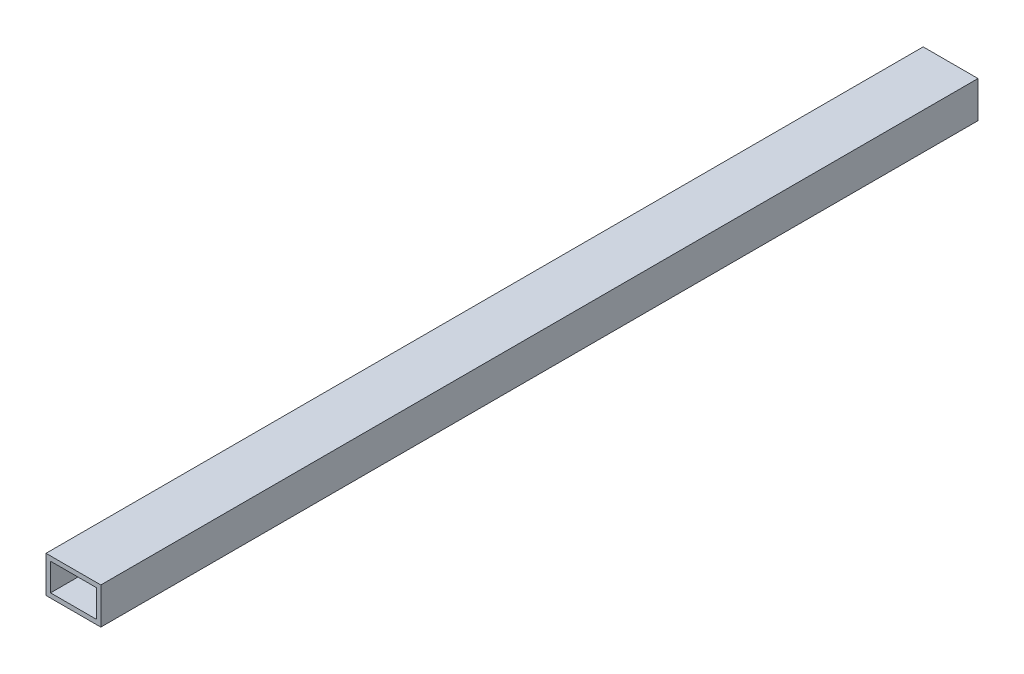
ISO-10303-21;
HEADER;
FILE_DESCRIPTION(('STEP AP214'),'2;1');
FILE_NAME('part.step','',(''),(''),'','','');
FILE_SCHEMA(('AUTOMOTIVE_DESIGN { 1 0 10303 214 1 1 1 1 }'));
ENDSEC;
DATA;
#1=APPLICATION_CONTEXT('core data for automotive mechanical design processes');
#2=APPLICATION_PROTOCOL_DEFINITION('international standard','automotive_design',2000,#1);
#3=PRODUCT_CONTEXT('',#1,'mechanical');
#4=PRODUCT('Part','Part','',(#3));
#5=PRODUCT_RELATED_PRODUCT_CATEGORY('part','',(#4));
#6=PRODUCT_DEFINITION_FORMATION('','',#4);
#7=PRODUCT_DEFINITION_CONTEXT('part definition',#1,'design');
#8=PRODUCT_DEFINITION('design','',#6,#7);
#9=PRODUCT_DEFINITION_SHAPE('','',#8);
#10=(LENGTH_UNIT() NAMED_UNIT(*) SI_UNIT(.MILLI.,.METRE.));
#11=(NAMED_UNIT(*) PLANE_ANGLE_UNIT() SI_UNIT($,.RADIAN.));
#12=(NAMED_UNIT(*) SI_UNIT($,.STERADIAN.) SOLID_ANGLE_UNIT());
#13=UNCERTAINTY_MEASURE_WITH_UNIT(LENGTH_MEASURE(1.E-05),#10,'distance_accuracy_value','');
#14=(GEOMETRIC_REPRESENTATION_CONTEXT(3) GLOBAL_UNCERTAINTY_ASSIGNED_CONTEXT((#13)) GLOBAL_UNIT_ASSIGNED_CONTEXT((#10,
#11,#12)) REPRESENTATION_CONTEXT('',''));
#15=CARTESIAN_POINT('',(0.,0.,0.));
#16=DIRECTION('',(0.,0.,1.));
#17=DIRECTION('',(1.,0.,0.));
#18=AXIS2_PLACEMENT_3D('',#15,#16,#17);
#19=CARTESIAN_POINT('',(0.,0.,304.8));
#20=DIRECTION('',(0.,0.,1.));
#21=DIRECTION('',(1.,0.,0.));
#22=AXIS2_PLACEMENT_3D('',#19,#20,#21);
#23=PLANE('',#22);
#24=DIRECTION('',(0.,-1.,0.));
#25=VECTOR('',#24,1.);
#26=CARTESIAN_POINT('',(-19.05,-12.7,304.8));
#27=LINE('',#26,#25);
#28=CARTESIAN_POINT('',(-19.05,12.7,304.8));
#29=VERTEX_POINT('',#28);
#30=CARTESIAN_POINT('',(-19.05,-12.7,304.8));
#31=VERTEX_POINT('',#30);
#32=EDGE_CURVE('E117',#29,#31,#27,.T.);
#33=ORIENTED_EDGE('',*,*,#32,.T.);
#34=DIRECTION('',(1.,0.,0.));
#35=VECTOR('',#34,1.);
#36=CARTESIAN_POINT('',(19.05,-12.7,304.8));
#37=LINE('',#36,#35);
#38=CARTESIAN_POINT('',(19.05,-12.7,304.8));
#39=VERTEX_POINT('',#38);
#40=EDGE_CURVE('E176',#31,#39,#37,.T.);
#41=ORIENTED_EDGE('',*,*,#40,.T.);
#42=DIRECTION('',(0.,1.,0.));
#43=VECTOR('',#42,1.);
#44=CARTESIAN_POINT('',(19.05,-12.7,304.8));
#45=LINE('',#44,#43);
#46=CARTESIAN_POINT('',(19.05,12.7,304.8));
#47=VERTEX_POINT('',#46);
#48=EDGE_CURVE('E179',#39,#47,#45,.T.);
#49=ORIENTED_EDGE('',*,*,#48,.T.);
#50=DIRECTION('',(-1.,0.,0.));
#51=VECTOR('',#50,1.);
#52=CARTESIAN_POINT('',(19.05,12.7,304.8));
#53=LINE('',#52,#51);
#54=EDGE_CURVE('E63',#47,#29,#53,.T.);
#55=ORIENTED_EDGE('',*,*,#54,.T.);
#56=EDGE_LOOP('',(#33,#41,#49,#55));
#57=FACE_BOUND('',#56,.T.);
#58=DIRECTION('',(1.,0.,0.));
#59=VECTOR('',#58,1.);
#60=CARTESIAN_POINT('',(15.875,-9.525,304.8));
#61=LINE('',#60,#59);
#62=CARTESIAN_POINT('',(-15.875,-9.525,304.8));
#63=VERTEX_POINT('',#62);
#64=CARTESIAN_POINT('',(15.875,-9.525,304.8));
#65=VERTEX_POINT('',#64);
#66=EDGE_CURVE('E158',#63,#65,#61,.T.);
#67=ORIENTED_EDGE('',*,*,#66,.F.);
#68=DIRECTION('',(0.,-1.,0.));
#69=VECTOR('',#68,1.);
#70=CARTESIAN_POINT('',(-15.875,-9.525,304.8));
#71=LINE('',#70,#69);
#72=CARTESIAN_POINT('',(-15.875,9.525,304.8));
#73=VERTEX_POINT('',#72);
#74=EDGE_CURVE('E113',#73,#63,#71,.T.);
#75=ORIENTED_EDGE('',*,*,#74,.F.);
#76=DIRECTION('',(-1.,0.,0.));
#77=VECTOR('',#76,1.);
#78=CARTESIAN_POINT('',(15.875,9.525,304.8));
#79=LINE('',#78,#77);
#80=CARTESIAN_POINT('',(15.875,9.525,304.8));
#81=VERTEX_POINT('',#80);
#82=EDGE_CURVE('E164',#81,#73,#79,.T.);
#83=ORIENTED_EDGE('',*,*,#82,.F.);
#84=DIRECTION('',(0.,1.,0.));
#85=VECTOR('',#84,1.);
#86=CARTESIAN_POINT('',(15.875,-9.525,304.8));
#87=LINE('',#86,#85);
#88=EDGE_CURVE('E161',#65,#81,#87,.T.);
#89=ORIENTED_EDGE('',*,*,#88,.F.);
#90=EDGE_LOOP('',(#67,#75,#83,#89));
#91=FACE_BOUND('',#90,.T.);
#92=ADVANCED_FACE('F39',(#57,#91),#23,.T.);
#93=CARTESIAN_POINT('',(-19.05,-12.7,304.8));
#94=DIRECTION('',(1.,0.,0.));
#95=DIRECTION('',(0.,0.,-1.));
#96=AXIS2_PLACEMENT_3D('',#93,#94,#95);
#97=PLANE('',#96);
#98=DIRECTION('',(0.,0.,-1.));
#99=VECTOR('',#98,1.);
#100=CARTESIAN_POINT('',(-19.05,12.7,304.8));
#101=LINE('',#100,#99);
#102=CARTESIAN_POINT('',(-19.05,12.7,-304.8));
#103=VERTEX_POINT('',#102);
#104=EDGE_CURVE('E184',#29,#103,#101,.T.);
#105=ORIENTED_EDGE('',*,*,#104,.T.);
#106=DIRECTION('',(0.,-1.,0.));
#107=VECTOR('',#106,1.);
#108=CARTESIAN_POINT('',(-19.05,-12.7,-304.8));
#109=LINE('',#108,#107);
#110=CARTESIAN_POINT('',(-19.05,-12.7,-304.8));
#111=VERTEX_POINT('',#110);
#112=EDGE_CURVE('E140',#103,#111,#109,.T.);
#113=ORIENTED_EDGE('',*,*,#112,.T.);
#114=DIRECTION('',(0.,0.,-1.));
#115=VECTOR('',#114,1.);
#116=CARTESIAN_POINT('',(-19.05,-12.7,304.8));
#117=LINE('',#116,#115);
#118=EDGE_CURVE('E11',#31,#111,#117,.T.);
#119=ORIENTED_EDGE('',*,*,#118,.F.);
#120=ORIENTED_EDGE('',*,*,#32,.F.);
#121=EDGE_LOOP('',(#105,#113,#119,#120));
#122=FACE_BOUND('',#121,.T.);
#123=ADVANCED_FACE('F41',(#122),#97,.F.);
#124=CARTESIAN_POINT('',(19.05,-12.7,304.8));
#125=DIRECTION('',(0.,1.,0.));
#126=DIRECTION('',(0.,0.,1.));
#127=AXIS2_PLACEMENT_3D('',#124,#125,#126);
#128=PLANE('',#127);
#129=ORIENTED_EDGE('',*,*,#118,.T.);
#130=DIRECTION('',(1.,0.,0.));
#131=VECTOR('',#130,1.);
#132=CARTESIAN_POINT('',(19.05,-12.7,-304.8));
#133=LINE('',#132,#131);
#134=CARTESIAN_POINT('',(19.05,-12.7,-304.8));
#135=VERTEX_POINT('',#134);
#136=EDGE_CURVE('E144',#111,#135,#133,.T.);
#137=ORIENTED_EDGE('',*,*,#136,.T.);
#138=DIRECTION('',(0.,0.,-1.));
#139=VECTOR('',#138,1.);
#140=CARTESIAN_POINT('',(19.05,-12.7,304.8));
#141=LINE('',#140,#139);
#142=EDGE_CURVE('E48',#39,#135,#141,.T.);
#143=ORIENTED_EDGE('',*,*,#142,.F.);
#144=ORIENTED_EDGE('',*,*,#40,.F.);
#145=EDGE_LOOP('',(#129,#137,#143,#144));
#146=FACE_BOUND('',#145,.T.);
#147=ADVANCED_FACE('F200',(#146),#128,.F.);
#148=CARTESIAN_POINT('',(19.05,-12.7,304.8));
#149=DIRECTION('',(-1.,0.,0.));
#150=DIRECTION('',(0.,-1.,0.));
#151=AXIS2_PLACEMENT_3D('',#148,#149,#150);
#152=PLANE('',#151);
#153=ORIENTED_EDGE('',*,*,#142,.T.);
#154=DIRECTION('',(0.,1.,0.));
#155=VECTOR('',#154,1.);
#156=CARTESIAN_POINT('',(19.05,-12.7,-304.8));
#157=LINE('',#156,#155);
#158=CARTESIAN_POINT('',(19.05,12.7,-304.8));
#159=VERTEX_POINT('',#158);
#160=EDGE_CURVE('E148',#135,#159,#157,.T.);
#161=ORIENTED_EDGE('',*,*,#160,.T.);
#162=DIRECTION('',(0.,0.,-1.));
#163=VECTOR('',#162,1.);
#164=CARTESIAN_POINT('',(19.05,12.7,304.8));
#165=LINE('',#164,#163);
#166=EDGE_CURVE('E187',#47,#159,#165,.T.);
#167=ORIENTED_EDGE('',*,*,#166,.F.);
#168=ORIENTED_EDGE('',*,*,#48,.F.);
#169=EDGE_LOOP('',(#153,#161,#167,#168));
#170=FACE_BOUND('',#169,.T.);
#171=ADVANCED_FACE('F194',(#170),#152,.F.);
#172=CARTESIAN_POINT('',(19.05,12.7,304.8));
#173=DIRECTION('',(0.,-1.,0.));
#174=DIRECTION('',(0.,0.,-1.));
#175=AXIS2_PLACEMENT_3D('',#172,#173,#174);
#176=PLANE('',#175);
#177=ORIENTED_EDGE('',*,*,#166,.T.);
#178=DIRECTION('',(-1.,0.,0.));
#179=VECTOR('',#178,1.);
#180=CARTESIAN_POINT('',(19.05,12.7,-304.8));
#181=LINE('',#180,#179);
#182=EDGE_CURVE('E152',#159,#103,#181,.T.);
#183=ORIENTED_EDGE('',*,*,#182,.T.);
#184=ORIENTED_EDGE('',*,*,#104,.F.);
#185=ORIENTED_EDGE('',*,*,#54,.F.);
#186=EDGE_LOOP('',(#177,#183,#184,#185));
#187=FACE_BOUND('',#186,.T.);
#188=ADVANCED_FACE('F205',(#187),#176,.F.);
#189=CARTESIAN_POINT('',(-15.875,-9.525,304.8));
#190=DIRECTION('',(1.,0.,0.));
#191=DIRECTION('',(0.,0.,-1.));
#192=AXIS2_PLACEMENT_3D('',#189,#190,#191);
#193=PLANE('',#192);
#194=DIRECTION('',(0.,0.,-1.));
#195=VECTOR('',#194,1.);
#196=CARTESIAN_POINT('',(-15.875,-9.525,304.8));
#197=LINE('',#196,#195);
#198=CARTESIAN_POINT('',(-15.875,-9.525,-304.8));
#199=VERTEX_POINT('',#198);
#200=EDGE_CURVE('E105',#63,#199,#197,.T.);
#201=ORIENTED_EDGE('',*,*,#200,.T.);
#202=DIRECTION('',(0.,-1.,0.));
#203=VECTOR('',#202,1.);
#204=CARTESIAN_POINT('',(-15.875,-9.525,-304.8));
#205=LINE('',#204,#203);
#206=CARTESIAN_POINT('',(-15.875,9.525,-304.8));
#207=VERTEX_POINT('',#206);
#208=EDGE_CURVE('E110',#207,#199,#205,.T.);
#209=ORIENTED_EDGE('',*,*,#208,.F.);
#210=DIRECTION('',(0.,0.,-1.));
#211=VECTOR('',#210,1.);
#212=CARTESIAN_POINT('',(-15.875,9.525,304.8));
#213=LINE('',#212,#211);
#214=EDGE_CURVE('E167',#73,#207,#213,.T.);
#215=ORIENTED_EDGE('',*,*,#214,.F.);
#216=ORIENTED_EDGE('',*,*,#74,.T.);
#217=EDGE_LOOP('',(#201,#209,#215,#216));
#218=FACE_BOUND('',#217,.T.);
#219=ADVANCED_FACE('F107',(#218),#193,.T.);
#220=CARTESIAN_POINT('',(15.875,-9.525,304.8));
#221=DIRECTION('',(0.,1.,0.));
#222=DIRECTION('',(0.,0.,1.));
#223=AXIS2_PLACEMENT_3D('',#220,#221,#222);
#224=PLANE('',#223);
#225=DIRECTION('',(0.,0.,-1.));
#226=VECTOR('',#225,1.);
#227=CARTESIAN_POINT('',(15.875,-9.525,304.8));
#228=LINE('',#227,#226);
#229=CARTESIAN_POINT('',(15.875,-9.525,-304.8));
#230=VERTEX_POINT('',#229);
#231=EDGE_CURVE('E118',#65,#230,#228,.T.);
#232=ORIENTED_EDGE('',*,*,#231,.T.);
#233=DIRECTION('',(1.,0.,0.));
#234=VECTOR('',#233,1.);
#235=CARTESIAN_POINT('',(15.875,-9.525,-304.8));
#236=LINE('',#235,#234);
#237=EDGE_CURVE('E121',#199,#230,#236,.T.);
#238=ORIENTED_EDGE('',*,*,#237,.F.);
#239=ORIENTED_EDGE('',*,*,#200,.F.);
#240=ORIENTED_EDGE('',*,*,#66,.T.);
#241=EDGE_LOOP('',(#232,#238,#239,#240));
#242=FACE_BOUND('',#241,.T.);
#243=ADVANCED_FACE('F122',(#242),#224,.T.);
#244=CARTESIAN_POINT('',(15.875,-9.525,304.8));
#245=DIRECTION('',(-1.,0.,0.));
#246=DIRECTION('',(0.,0.,1.));
#247=AXIS2_PLACEMENT_3D('',#244,#245,#246);
#248=PLANE('',#247);
#249=DIRECTION('',(0.,0.,-1.));
#250=VECTOR('',#249,1.);
#251=CARTESIAN_POINT('',(15.875,9.525,304.8));
#252=LINE('',#251,#250);
#253=CARTESIAN_POINT('',(15.875,9.525,-304.8));
#254=VERTEX_POINT('',#253);
#255=EDGE_CURVE('E55',#81,#254,#252,.T.);
#256=ORIENTED_EDGE('',*,*,#255,.T.);
#257=DIRECTION('',(0.,1.,0.));
#258=VECTOR('',#257,1.);
#259=CARTESIAN_POINT('',(15.875,-9.525,-304.8));
#260=LINE('',#259,#258);
#261=EDGE_CURVE('E128',#230,#254,#260,.T.);
#262=ORIENTED_EDGE('',*,*,#261,.F.);
#263=ORIENTED_EDGE('',*,*,#231,.F.);
#264=ORIENTED_EDGE('',*,*,#88,.T.);
#265=EDGE_LOOP('',(#256,#262,#263,#264));
#266=FACE_BOUND('',#265,.T.);
#267=ADVANCED_FACE('F223',(#266),#248,.T.);
#268=CARTESIAN_POINT('',(15.875,9.525,304.8));
#269=DIRECTION('',(0.,-1.,0.));
#270=DIRECTION('',(1.,0.,0.));
#271=AXIS2_PLACEMENT_3D('',#268,#269,#270);
#272=PLANE('',#271);
#273=ORIENTED_EDGE('',*,*,#214,.T.);
#274=DIRECTION('',(-1.,0.,0.));
#275=VECTOR('',#274,1.);
#276=CARTESIAN_POINT('',(15.875,9.525,-304.8));
#277=LINE('',#276,#275);
#278=EDGE_CURVE('E132',#254,#207,#277,.T.);
#279=ORIENTED_EDGE('',*,*,#278,.F.);
#280=ORIENTED_EDGE('',*,*,#255,.F.);
#281=ORIENTED_EDGE('',*,*,#82,.T.);
#282=EDGE_LOOP('',(#273,#279,#280,#281));
#283=FACE_BOUND('',#282,.T.);
#284=ADVANCED_FACE('F226',(#283),#272,.T.);
#285=CARTESIAN_POINT('',(0.,0.,-304.8));
#286=DIRECTION('',(0.,0.,1.));
#287=DIRECTION('',(1.,0.,0.));
#288=AXIS2_PLACEMENT_3D('',#285,#286,#287);
#289=PLANE('',#288);
#290=ORIENTED_EDGE('',*,*,#278,.T.);
#291=ORIENTED_EDGE('',*,*,#208,.T.);
#292=ORIENTED_EDGE('',*,*,#237,.T.);
#293=ORIENTED_EDGE('',*,*,#261,.T.);
#294=EDGE_LOOP('',(#290,#291,#292,#293));
#295=FACE_BOUND('',#294,.T.);
#296=ORIENTED_EDGE('',*,*,#112,.F.);
#297=ORIENTED_EDGE('',*,*,#182,.F.);
#298=ORIENTED_EDGE('',*,*,#160,.F.);
#299=ORIENTED_EDGE('',*,*,#136,.F.);
#300=EDGE_LOOP('',(#296,#297,#298,#299));
#301=FACE_BOUND('',#300,.T.);
#302=ADVANCED_FACE('F130',(#295,#301),#289,.F.);
#303=CLOSED_SHELL('',(#92,#123,#147,#171,#188,#219,#243,#267,#284,#302));
#304=MANIFOLD_SOLID_BREP('B2',#303);
#305=ADVANCED_BREP_SHAPE_REPRESENTATION('',(#18,#304),#14);
#306=SHAPE_DEFINITION_REPRESENTATION(#9,#305);
ENDSEC;
END-ISO-10303-21;
